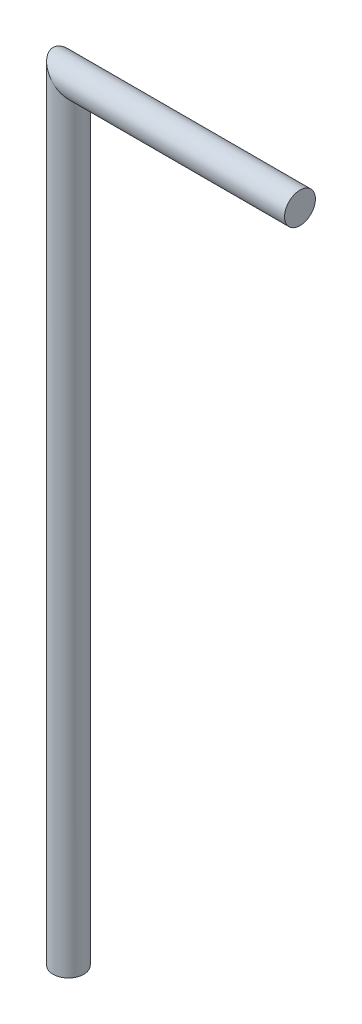
ISO-10303-21;
HEADER;
FILE_DESCRIPTION(('STEP AP214'),'2;1');
FILE_NAME('part.step','',(''),(''),'','','');
FILE_SCHEMA(('AUTOMOTIVE_DESIGN { 1 0 10303 214 1 1 1 1 }'));
ENDSEC;
DATA;
#1=APPLICATION_CONTEXT('core data for automotive mechanical design processes');
#2=APPLICATION_PROTOCOL_DEFINITION('international standard','automotive_design',2000,#1);
#3=PRODUCT_CONTEXT('',#1,'mechanical');
#4=PRODUCT('Part','Part','',(#3));
#5=PRODUCT_RELATED_PRODUCT_CATEGORY('part','',(#4));
#6=PRODUCT_DEFINITION_FORMATION('','',#4);
#7=PRODUCT_DEFINITION_CONTEXT('part definition',#1,'design');
#8=PRODUCT_DEFINITION('design','',#6,#7);
#9=PRODUCT_DEFINITION_SHAPE('','',#8);
#10=(LENGTH_UNIT() NAMED_UNIT(*) SI_UNIT(.MILLI.,.METRE.));
#11=(NAMED_UNIT(*) PLANE_ANGLE_UNIT() SI_UNIT($,.RADIAN.));
#12=(NAMED_UNIT(*) SI_UNIT($,.STERADIAN.) SOLID_ANGLE_UNIT());
#13=UNCERTAINTY_MEASURE_WITH_UNIT(LENGTH_MEASURE(1.E-05),#10,'distance_accuracy_value','');
#14=(GEOMETRIC_REPRESENTATION_CONTEXT(3) GLOBAL_UNCERTAINTY_ASSIGNED_CONTEXT((#13)) GLOBAL_UNIT_ASSIGNED_CONTEXT((#10,
#11,#12)) REPRESENTATION_CONTEXT('',''));
#15=CARTESIAN_POINT('',(0.,0.,0.));
#16=DIRECTION('',(0.,0.,1.));
#17=DIRECTION('',(1.,0.,0.));
#18=AXIS2_PLACEMENT_3D('',#15,#16,#17);
#19=CARTESIAN_POINT('',(15.,50.,0.));
#20=DIRECTION('',(1.,0.,0.));
#21=DIRECTION('',(0.,0.,1.));
#22=AXIS2_PLACEMENT_3D('',#19,#20,#21);
#23=PLANE('',#22);
#24=CARTESIAN_POINT('',(15.,50.,0.));
#25=DIRECTION('',(1.,0.,0.));
#26=DIRECTION('',(0.,0.,1.));
#27=AXIS2_PLACEMENT_3D('',#24,#25,#26);
#28=CIRCLE('',#27,1.);
#29=CARTESIAN_POINT('',(15.,50.,1.));
#30=VERTEX_POINT('',#29);
#31=EDGE_CURVE('E40',#30,#30,#28,.T.);
#32=ORIENTED_EDGE('',*,*,#31,.T.);
#33=EDGE_LOOP('',(#32));
#34=FACE_BOUND('',#33,.T.);
#35=ADVANCED_FACE('F37',(#34),#23,.T.);
#36=CARTESIAN_POINT('',(0.,0.,0.));
#37=DIRECTION('',(0.,1.,0.));
#38=DIRECTION('',(0.,0.,1.));
#39=AXIS2_PLACEMENT_3D('',#36,#37,#38);
#40=PLANE('',#39);
#41=CARTESIAN_POINT('',(0.,0.,0.));
#42=DIRECTION('',(0.,1.,0.));
#43=DIRECTION('',(0.,0.,1.));
#44=AXIS2_PLACEMENT_3D('',#41,#42,#43);
#45=CIRCLE('',#44,1.);
#46=CARTESIAN_POINT('',(0.,0.,1.));
#47=VERTEX_POINT('',#46);
#48=EDGE_CURVE('E45',#47,#47,#45,.T.);
#49=ORIENTED_EDGE('',*,*,#48,.F.);
#50=EDGE_LOOP('',(#49));
#51=FACE_BOUND('',#50,.T.);
#52=ADVANCED_FACE('F61',(#51),#40,.F.);
#53=CARTESIAN_POINT('',(-2.29999999999999,50.,0.));
#54=DIRECTION('',(1.,0.,0.));
#55=DIRECTION('',(0.,0.,-1.));
#56=AXIS2_PLACEMENT_3D('',#53,#54,#55);
#57=CYLINDRICAL_SURFACE('',#56,1.);
#58=CARTESIAN_POINT('',(0.,50.,0.));
#59=DIRECTION('',(0.707106781186547,0.707106781186547,0.));
#60=DIRECTION('',(-0.707106781186548,0.707106781186548,0.));
#61=AXIS2_PLACEMENT_3D('',#58,#59,#60);
#62=ELLIPSE('',#61,1.4142135623731,1.);
#63=CARTESIAN_POINT('',(-1.,51.,0.));
#64=VERTEX_POINT('',#63);
#65=EDGE_CURVE('E10',#64,#64,#62,.F.);
#66=ORIENTED_EDGE('',*,*,#65,.F.);
#67=EDGE_LOOP('',(#66));
#68=FACE_BOUND('',#67,.T.);
#69=ORIENTED_EDGE('',*,*,#31,.F.);
#70=EDGE_LOOP('',(#69));
#71=FACE_BOUND('',#70,.T.);
#72=ADVANCED_FACE('F58',(#68,#71),#57,.T.);
#73=CARTESIAN_POINT('',(0.,0.,0.));
#74=DIRECTION('',(0.,1.,0.));
#75=DIRECTION('',(0.,0.,1.));
#76=AXIS2_PLACEMENT_3D('',#73,#74,#75);
#77=CYLINDRICAL_SURFACE('',#76,1.);
#78=ORIENTED_EDGE('',*,*,#48,.T.);
#79=EDGE_LOOP('',(#78));
#80=FACE_BOUND('',#79,.T.);
#81=ORIENTED_EDGE('',*,*,#65,.T.);
#82=EDGE_LOOP('',(#81));
#83=FACE_BOUND('',#82,.T.);
#84=ADVANCED_FACE('F60',(#80,#83),#77,.T.);
#85=CLOSED_SHELL('',(#35,#52,#72,#84));
#86=MANIFOLD_SOLID_BREP('B2',#85);
#87=ADVANCED_BREP_SHAPE_REPRESENTATION('',(#18,#86),#14);
#88=SHAPE_DEFINITION_REPRESENTATION(#9,#87);
ENDSEC;
END-ISO-10303-21;
